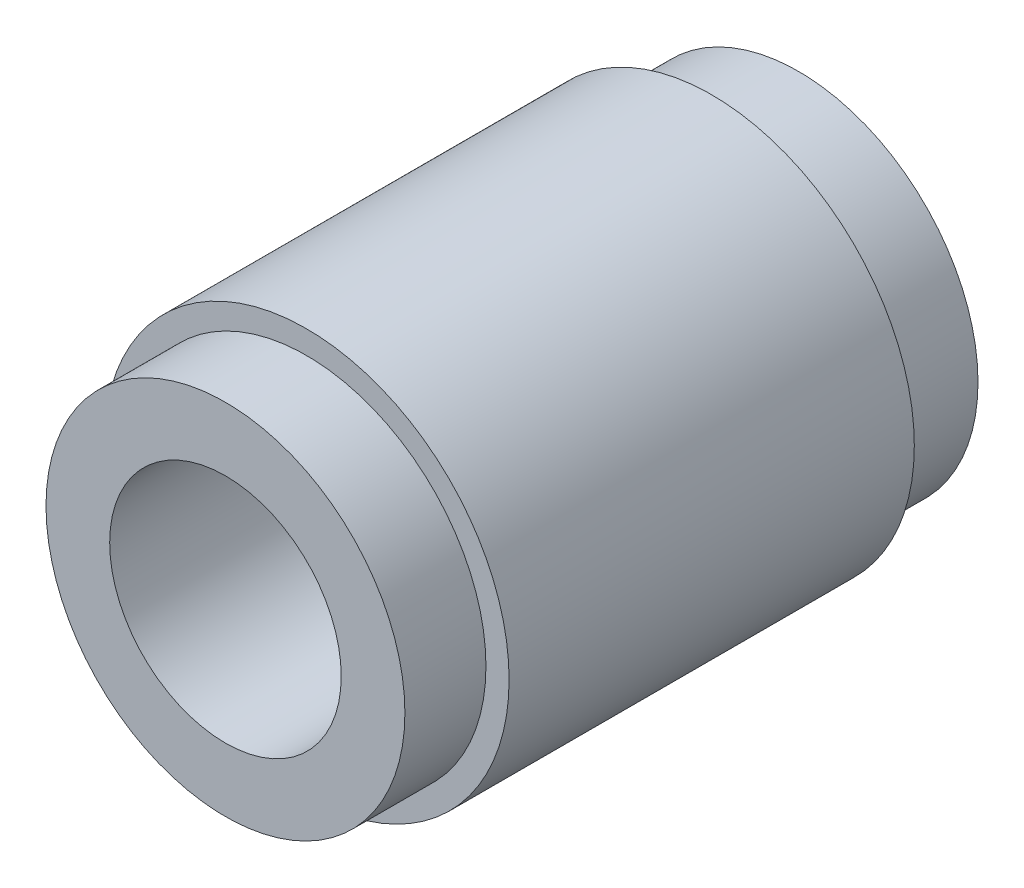
ISO-10303-21;
HEADER;
FILE_DESCRIPTION(('STEP AP214'),'2;1');
FILE_NAME('part.step','',(''),(''),'','','');
FILE_SCHEMA(('AUTOMOTIVE_DESIGN { 1 0 10303 214 1 1 1 1 }'));
ENDSEC;
DATA;
#1=APPLICATION_CONTEXT('core data for automotive mechanical design processes');
#2=APPLICATION_PROTOCOL_DEFINITION('international standard','automotive_design',2000,#1);
#3=PRODUCT_CONTEXT('',#1,'mechanical');
#4=PRODUCT('Part','Part','',(#3));
#5=PRODUCT_RELATED_PRODUCT_CATEGORY('part','',(#4));
#6=PRODUCT_DEFINITION_FORMATION('','',#4);
#7=PRODUCT_DEFINITION_CONTEXT('part definition',#1,'design');
#8=PRODUCT_DEFINITION('design','',#6,#7);
#9=PRODUCT_DEFINITION_SHAPE('','',#8);
#10=(LENGTH_UNIT() NAMED_UNIT(*) SI_UNIT(.MILLI.,.METRE.));
#11=(NAMED_UNIT(*) PLANE_ANGLE_UNIT() SI_UNIT($,.RADIAN.));
#12=(NAMED_UNIT(*) SI_UNIT($,.STERADIAN.) SOLID_ANGLE_UNIT());
#13=UNCERTAINTY_MEASURE_WITH_UNIT(LENGTH_MEASURE(1.E-05),#10,'distance_accuracy_value','');
#14=(GEOMETRIC_REPRESENTATION_CONTEXT(3) GLOBAL_UNCERTAINTY_ASSIGNED_CONTEXT((#13)) GLOBAL_UNIT_ASSIGNED_CONTEXT((#10,
#11,#12)) REPRESENTATION_CONTEXT('',''));
#15=CARTESIAN_POINT('',(0.,0.,0.));
#16=DIRECTION('',(0.,0.,1.));
#17=DIRECTION('',(1.,0.,0.));
#18=AXIS2_PLACEMENT_3D('',#15,#16,#17);
#19=CARTESIAN_POINT('',(0.,0.,0.));
#20=DIRECTION('',(0.,0.,1.));
#21=DIRECTION('',(1.,0.,0.));
#22=AXIS2_PLACEMENT_3D('',#19,#20,#21);
#23=PLANE('',#22);
#24=CARTESIAN_POINT('',(0.,0.,0.));
#25=DIRECTION('',(0.,0.,1.));
#26=DIRECTION('',(1.,0.,0.));
#27=AXIS2_PLACEMENT_3D('',#24,#25,#26);
#28=CIRCLE('',#27,3.1);
#29=CARTESIAN_POINT('',(3.1,0.,0.));
#30=VERTEX_POINT('',#29);
#31=EDGE_CURVE('E41',#30,#30,#28,.T.);
#32=ORIENTED_EDGE('',*,*,#31,.F.);
#33=EDGE_LOOP('',(#32));
#34=FACE_BOUND('',#33,.T.);
#35=CARTESIAN_POINT('',(0.,0.,0.));
#36=DIRECTION('',(0.,0.,1.));
#37=DIRECTION('',(1.,0.,0.));
#38=AXIS2_PLACEMENT_3D('',#35,#36,#37);
#39=CIRCLE('',#38,2.);
#40=CARTESIAN_POINT('',(2.,0.,0.));
#41=VERTEX_POINT('',#40);
#42=EDGE_CURVE('E60',#41,#41,#39,.T.);
#43=ORIENTED_EDGE('',*,*,#42,.T.);
#44=EDGE_LOOP('',(#43));
#45=FACE_BOUND('',#44,.T.);
#46=ADVANCED_FACE('F37',(#34,#45),#23,.F.);
#47=CARTESIAN_POINT('',(0.,0.,1.5));
#48=DIRECTION('',(0.,0.,-1.));
#49=DIRECTION('',(-1.,0.,0.));
#50=AXIS2_PLACEMENT_3D('',#47,#48,#49);
#51=CYLINDRICAL_SURFACE('',#50,3.1);
#52=CARTESIAN_POINT('',(0.,0.,1.5));
#53=DIRECTION('',(0.,0.,1.));
#54=DIRECTION('',(1.,0.,0.));
#55=AXIS2_PLACEMENT_3D('',#52,#53,#54);
#56=CIRCLE('',#55,3.1);
#57=CARTESIAN_POINT('',(3.1,0.,1.5));
#58=VERTEX_POINT('',#57);
#59=EDGE_CURVE('E46',#58,#58,#56,.T.);
#60=ORIENTED_EDGE('',*,*,#59,.F.);
#61=EDGE_LOOP('',(#60));
#62=FACE_BOUND('',#61,.T.);
#63=ORIENTED_EDGE('',*,*,#31,.T.);
#64=EDGE_LOOP('',(#63));
#65=FACE_BOUND('',#64,.T.);
#66=ADVANCED_FACE('F39',(#62,#65),#51,.T.);
#67=CARTESIAN_POINT('',(0.,0.,1.5));
#68=DIRECTION('',(0.,0.,-1.));
#69=DIRECTION('',(-1.,0.,0.));
#70=AXIS2_PLACEMENT_3D('',#67,#68,#69);
#71=CYLINDRICAL_SURFACE('',#70,2.);
#72=ORIENTED_EDGE('',*,*,#42,.F.);
#73=EDGE_LOOP('',(#72));
#74=FACE_BOUND('',#73,.T.);
#75=CARTESIAN_POINT('',(0.,0.,9.9));
#76=DIRECTION('',(0.,0.,1.));
#77=DIRECTION('',(1.,0.,0.));
#78=AXIS2_PLACEMENT_3D('',#75,#76,#77);
#79=CIRCLE('',#78,2.);
#80=CARTESIAN_POINT('',(2.,0.,9.9));
#81=VERTEX_POINT('',#80);
#82=EDGE_CURVE('E110',#81,#81,#79,.T.);
#83=ORIENTED_EDGE('',*,*,#82,.T.);
#84=EDGE_LOOP('',(#83));
#85=FACE_BOUND('',#84,.T.);
#86=ADVANCED_FACE('F78',(#74,#85),#71,.F.);
#87=CARTESIAN_POINT('',(0.,0.,8.5));
#88=DIRECTION('',(0.,0.,1.));
#89=DIRECTION('',(1.,0.,0.));
#90=AXIS2_PLACEMENT_3D('',#87,#88,#89);
#91=PLANE('',#90);
#92=CARTESIAN_POINT('',(0.,0.,8.5));
#93=DIRECTION('',(0.,0.,1.));
#94=DIRECTION('',(1.,0.,0.));
#95=AXIS2_PLACEMENT_3D('',#92,#93,#94);
#96=CIRCLE('',#95,3.1);
#97=CARTESIAN_POINT('',(3.1,0.,8.5));
#98=VERTEX_POINT('',#97);
#99=EDGE_CURVE('E10',#98,#98,#96,.T.);
#100=ORIENTED_EDGE('',*,*,#99,.F.);
#101=EDGE_LOOP('',(#100));
#102=FACE_BOUND('',#101,.T.);
#103=CARTESIAN_POINT('',(0.,0.,8.5));
#104=DIRECTION('',(0.,0.,1.));
#105=DIRECTION('',(1.,0.,0.));
#106=AXIS2_PLACEMENT_3D('',#103,#104,#105);
#107=CIRCLE('',#106,3.5);
#108=CARTESIAN_POINT('',(3.5,0.,8.5));
#109=VERTEX_POINT('',#108);
#110=EDGE_CURVE('E56',#109,#109,#107,.T.);
#111=ORIENTED_EDGE('',*,*,#110,.T.);
#112=EDGE_LOOP('',(#111));
#113=FACE_BOUND('',#112,.T.);
#114=ADVANCED_FACE('F83',(#102,#113),#91,.T.);
#115=CARTESIAN_POINT('',(0.,0.,1.5));
#116=DIRECTION('',(0.,0.,1.));
#117=DIRECTION('',(1.,0.,0.));
#118=AXIS2_PLACEMENT_3D('',#115,#116,#117);
#119=PLANE('',#118);
#120=ORIENTED_EDGE('',*,*,#59,.T.);
#121=EDGE_LOOP('',(#120));
#122=FACE_BOUND('',#121,.T.);
#123=CARTESIAN_POINT('',(0.,0.,1.5));
#124=DIRECTION('',(0.,0.,1.));
#125=DIRECTION('',(1.,0.,0.));
#126=AXIS2_PLACEMENT_3D('',#123,#124,#125);
#127=CIRCLE('',#126,3.5);
#128=CARTESIAN_POINT('',(3.5,0.,1.5));
#129=VERTEX_POINT('',#128);
#130=EDGE_CURVE('E61',#129,#129,#127,.T.);
#131=ORIENTED_EDGE('',*,*,#130,.F.);
#132=EDGE_LOOP('',(#131));
#133=FACE_BOUND('',#132,.T.);
#134=ADVANCED_FACE('F89',(#122,#133),#119,.F.);
#135=CARTESIAN_POINT('',(0.,0.,8.5));
#136=DIRECTION('',(0.,0.,-1.));
#137=DIRECTION('',(-1.,0.,0.));
#138=AXIS2_PLACEMENT_3D('',#135,#136,#137);
#139=CYLINDRICAL_SURFACE('',#138,3.5);
#140=ORIENTED_EDGE('',*,*,#110,.F.);
#141=EDGE_LOOP('',(#140));
#142=FACE_BOUND('',#141,.T.);
#143=ORIENTED_EDGE('',*,*,#130,.T.);
#144=EDGE_LOOP('',(#143));
#145=FACE_BOUND('',#144,.T.);
#146=ADVANCED_FACE('F85',(#142,#145),#139,.T.);
#147=CARTESIAN_POINT('',(0.,0.,9.9));
#148=DIRECTION('',(0.,0.,1.));
#149=DIRECTION('',(1.,0.,0.));
#150=AXIS2_PLACEMENT_3D('',#147,#148,#149);
#151=PLANE('',#150);
#152=CARTESIAN_POINT('',(0.,0.,9.9));
#153=DIRECTION('',(0.,0.,1.));
#154=DIRECTION('',(1.,0.,0.));
#155=AXIS2_PLACEMENT_3D('',#152,#153,#154);
#156=CIRCLE('',#155,3.1);
#157=CARTESIAN_POINT('',(3.1,0.,9.9));
#158=VERTEX_POINT('',#157);
#159=EDGE_CURVE('E54',#158,#158,#156,.T.);
#160=ORIENTED_EDGE('',*,*,#159,.T.);
#161=EDGE_LOOP('',(#160));
#162=FACE_BOUND('',#161,.T.);
#163=ORIENTED_EDGE('',*,*,#82,.F.);
#164=EDGE_LOOP('',(#163));
#165=FACE_BOUND('',#164,.T.);
#166=ADVANCED_FACE('F88',(#162,#165),#151,.T.);
#167=CARTESIAN_POINT('',(0.,0.,9.9));
#168=DIRECTION('',(0.,0.,-1.));
#169=DIRECTION('',(-1.,0.,0.));
#170=AXIS2_PLACEMENT_3D('',#167,#168,#169);
#171=CYLINDRICAL_SURFACE('',#170,3.1);
#172=ORIENTED_EDGE('',*,*,#159,.F.);
#173=EDGE_LOOP('',(#172));
#174=FACE_BOUND('',#173,.T.);
#175=ORIENTED_EDGE('',*,*,#99,.T.);
#176=EDGE_LOOP('',(#175));
#177=FACE_BOUND('',#176,.T.);
#178=ADVANCED_FACE('F97',(#174,#177),#171,.T.);
#179=CLOSED_SHELL('',(#46,#66,#86,#114,#134,#146,#166,#178));
#180=MANIFOLD_SOLID_BREP('B2',#179);
#181=ADVANCED_BREP_SHAPE_REPRESENTATION('',(#18,#180),#14);
#182=SHAPE_DEFINITION_REPRESENTATION(#9,#181);
ENDSEC;
END-ISO-10303-21;
